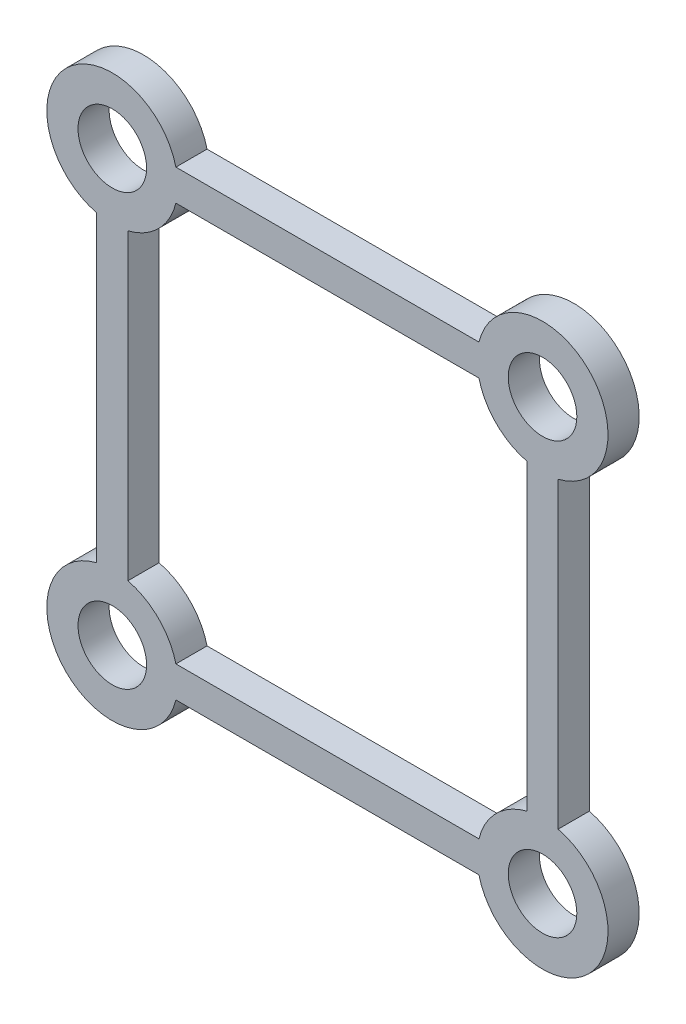
ISO-10303-21;
HEADER;
FILE_DESCRIPTION(('STEP AP214'),'2;1');
FILE_NAME('part.step','',(''),(''),'','','');
FILE_SCHEMA(('AUTOMOTIVE_DESIGN { 1 0 10303 214 1 1 1 1 }'));
ENDSEC;
DATA;
#1=APPLICATION_CONTEXT('core data for automotive mechanical design processes');
#2=APPLICATION_PROTOCOL_DEFINITION('international standard','automotive_design',2000,#1);
#3=PRODUCT_CONTEXT('',#1,'mechanical');
#4=PRODUCT('Part','Part','',(#3));
#5=PRODUCT_RELATED_PRODUCT_CATEGORY('part','',(#4));
#6=PRODUCT_DEFINITION_FORMATION('','',#4);
#7=PRODUCT_DEFINITION_CONTEXT('part definition',#1,'design');
#8=PRODUCT_DEFINITION('design','',#6,#7);
#9=PRODUCT_DEFINITION_SHAPE('','',#8);
#10=(LENGTH_UNIT() NAMED_UNIT(*) SI_UNIT(.MILLI.,.METRE.));
#11=(NAMED_UNIT(*) PLANE_ANGLE_UNIT() SI_UNIT($,.RADIAN.));
#12=(NAMED_UNIT(*) SI_UNIT($,.STERADIAN.) SOLID_ANGLE_UNIT());
#13=UNCERTAINTY_MEASURE_WITH_UNIT(LENGTH_MEASURE(1.E-05),#10,'distance_accuracy_value','');
#14=(GEOMETRIC_REPRESENTATION_CONTEXT(3) GLOBAL_UNCERTAINTY_ASSIGNED_CONTEXT((#13)) GLOBAL_UNIT_ASSIGNED_CONTEXT((#10,
#11,#12)) REPRESENTATION_CONTEXT('',''));
#15=CARTESIAN_POINT('',(0.,0.,0.));
#16=DIRECTION('',(0.,0.,1.));
#17=DIRECTION('',(1.,0.,0.));
#18=AXIS2_PLACEMENT_3D('',#15,#16,#17);
#19=CARTESIAN_POINT('',(6.9,6.9,1.));
#20=DIRECTION('',(0.,0.,1.));
#21=DIRECTION('',(1.,0.,0.));
#22=AXIS2_PLACEMENT_3D('',#19,#20,#21);
#23=PLANE('',#22);
#24=CARTESIAN_POINT('',(6.9,-6.9,1.));
#25=DIRECTION('',(0.,0.,1.));
#26=DIRECTION('',(1.,0.,0.));
#27=AXIS2_PLACEMENT_3D('',#24,#25,#26);
#28=CIRCLE('',#27,1.1);
#29=CARTESIAN_POINT('',(8.,-6.9,1.));
#30=VERTEX_POINT('',#29);
#31=EDGE_CURVE('E257',#30,#30,#28,.T.);
#32=ORIENTED_EDGE('',*,*,#31,.F.);
#33=EDGE_LOOP('',(#32));
#34=FACE_BOUND('',#33,.T.);
#35=CARTESIAN_POINT('',(-6.9,-6.9,1.));
#36=DIRECTION('',(0.,0.,1.));
#37=DIRECTION('',(1.,0.,0.));
#38=AXIS2_PLACEMENT_3D('',#35,#36,#37);
#39=CIRCLE('',#38,1.1);
#40=CARTESIAN_POINT('',(-5.8,-6.9,1.));
#41=VERTEX_POINT('',#40);
#42=EDGE_CURVE('E275',#41,#41,#39,.T.);
#43=ORIENTED_EDGE('',*,*,#42,.F.);
#44=EDGE_LOOP('',(#43));
#45=FACE_BOUND('',#44,.T.);
#46=CARTESIAN_POINT('',(6.9,6.9,1.));
#47=DIRECTION('',(0.,0.,1.));
#48=DIRECTION('',(1.,0.,0.));
#49=AXIS2_PLACEMENT_3D('',#46,#47,#48);
#50=CIRCLE('',#49,2.1);
#51=CARTESIAN_POINT('',(7.4,4.86039219456289,1.));
#52=VERTEX_POINT('',#51);
#53=CARTESIAN_POINT('',(4.86039219456289,7.4,1.));
#54=VERTEX_POINT('',#53);
#55=EDGE_CURVE('E278',#52,#54,#50,.T.);
#56=ORIENTED_EDGE('',*,*,#55,.T.);
#57=DIRECTION('',(-1.,0.,0.));
#58=VECTOR('',#57,1.);
#59=CARTESIAN_POINT('',(4.86039219456289,7.4,1.));
#60=LINE('',#59,#58);
#61=CARTESIAN_POINT('',(-4.86039219456289,7.4,1.));
#62=VERTEX_POINT('',#61);
#63=EDGE_CURVE('E281',#54,#62,#60,.T.);
#64=ORIENTED_EDGE('',*,*,#63,.T.);
#65=CARTESIAN_POINT('',(-6.9,6.9,1.));
#66=DIRECTION('',(0.,0.,1.));
#67=DIRECTION('',(1.,0.,0.));
#68=AXIS2_PLACEMENT_3D('',#65,#66,#67);
#69=CIRCLE('',#68,2.1);
#70=CARTESIAN_POINT('',(-7.4,4.86039219456289,1.));
#71=VERTEX_POINT('',#70);
#72=EDGE_CURVE('E290',#62,#71,#69,.T.);
#73=ORIENTED_EDGE('',*,*,#72,.T.);
#74=DIRECTION('',(0.,-1.,0.));
#75=VECTOR('',#74,1.);
#76=CARTESIAN_POINT('',(-7.4,-4.86039219456289,1.));
#77=LINE('',#76,#75);
#78=CARTESIAN_POINT('',(-7.4,-4.86039219456289,1.));
#79=VERTEX_POINT('',#78);
#80=EDGE_CURVE('E293',#71,#79,#77,.T.);
#81=ORIENTED_EDGE('',*,*,#80,.T.);
#82=CARTESIAN_POINT('',(-6.9,-6.9,1.));
#83=DIRECTION('',(0.,0.,1.));
#84=DIRECTION('',(1.,0.,0.));
#85=AXIS2_PLACEMENT_3D('',#82,#83,#84);
#86=CIRCLE('',#85,2.1);
#87=CARTESIAN_POINT('',(-4.86039219456289,-7.4,1.));
#88=VERTEX_POINT('',#87);
#89=EDGE_CURVE('E295',#79,#88,#86,.T.);
#90=ORIENTED_EDGE('',*,*,#89,.T.);
#91=DIRECTION('',(1.,0.,0.));
#92=VECTOR('',#91,1.);
#93=CARTESIAN_POINT('',(4.86039219456289,-7.4,1.));
#94=LINE('',#93,#92);
#95=CARTESIAN_POINT('',(4.86039219456289,-7.4,1.));
#96=VERTEX_POINT('',#95);
#97=EDGE_CURVE('E300',#88,#96,#94,.T.);
#98=ORIENTED_EDGE('',*,*,#97,.T.);
#99=CARTESIAN_POINT('',(6.9,-6.9,1.));
#100=DIRECTION('',(0.,0.,1.));
#101=DIRECTION('',(1.,0.,0.));
#102=AXIS2_PLACEMENT_3D('',#99,#100,#101);
#103=CIRCLE('',#102,2.1);
#104=CARTESIAN_POINT('',(7.4,-4.86039219456289,1.));
#105=VERTEX_POINT('',#104);
#106=EDGE_CURVE('E297',#96,#105,#103,.T.);
#107=ORIENTED_EDGE('',*,*,#106,.T.);
#108=DIRECTION('',(0.,1.,0.));
#109=VECTOR('',#108,1.);
#110=CARTESIAN_POINT('',(7.4,-4.86039219456289,1.));
#111=LINE('',#110,#109);
#112=EDGE_CURVE('E303',#105,#52,#111,.T.);
#113=ORIENTED_EDGE('',*,*,#112,.T.);
#114=EDGE_LOOP('',(#56,#64,#73,#81,#90,#98,#107,#113));
#115=FACE_BOUND('',#114,.T.);
#116=CARTESIAN_POINT('',(-6.9,6.9,1.));
#117=DIRECTION('',(0.,0.,1.));
#118=DIRECTION('',(1.,0.,0.));
#119=AXIS2_PLACEMENT_3D('',#116,#117,#118);
#120=CIRCLE('',#119,1.1);
#121=CARTESIAN_POINT('',(-5.8,6.9,1.));
#122=VERTEX_POINT('',#121);
#123=EDGE_CURVE('E261',#122,#122,#120,.T.);
#124=ORIENTED_EDGE('',*,*,#123,.F.);
#125=EDGE_LOOP('',(#124));
#126=FACE_BOUND('',#125,.T.);
#127=CARTESIAN_POINT('',(6.9,6.9,1.));
#128=DIRECTION('',(0.,0.,1.));
#129=DIRECTION('',(1.,0.,0.));
#130=AXIS2_PLACEMENT_3D('',#127,#128,#129);
#131=CIRCLE('',#130,1.1);
#132=CARTESIAN_POINT('',(8.,6.9,1.));
#133=VERTEX_POINT('',#132);
#134=EDGE_CURVE('E247',#133,#133,#131,.T.);
#135=ORIENTED_EDGE('',*,*,#134,.F.);
#136=EDGE_LOOP('',(#135));
#137=FACE_BOUND('',#136,.T.);
#138=DIRECTION('',(0.,-1.,0.));
#139=VECTOR('',#138,1.);
#140=CARTESIAN_POINT('',(-6.4,-4.86039219456289,1.));
#141=LINE('',#140,#139);
#142=CARTESIAN_POINT('',(-6.4,4.86039219456289,1.));
#143=VERTEX_POINT('',#142);
#144=CARTESIAN_POINT('',(-6.4,-4.86039219456289,1.));
#145=VERTEX_POINT('',#144);
#146=EDGE_CURVE('E166',#143,#145,#141,.T.);
#147=ORIENTED_EDGE('',*,*,#146,.F.);
#148=CARTESIAN_POINT('',(-6.9,6.9,1.));
#149=DIRECTION('',(0.,0.,-1.));
#150=DIRECTION('',(1.,0.,0.));
#151=AXIS2_PLACEMENT_3D('',#148,#149,#150);
#152=CIRCLE('',#151,2.1);
#153=CARTESIAN_POINT('',(-4.86039219456289,6.4,1.));
#154=VERTEX_POINT('',#153);
#155=EDGE_CURVE('E156',#154,#143,#152,.T.);
#156=ORIENTED_EDGE('',*,*,#155,.F.);
#157=DIRECTION('',(-1.,0.,0.));
#158=VECTOR('',#157,1.);
#159=CARTESIAN_POINT('',(4.86039219456289,6.4,1.));
#160=LINE('',#159,#158);
#161=CARTESIAN_POINT('',(4.86039219456289,6.4,1.));
#162=VERTEX_POINT('',#161);
#163=EDGE_CURVE('E198',#162,#154,#160,.T.);
#164=ORIENTED_EDGE('',*,*,#163,.F.);
#165=CARTESIAN_POINT('',(6.9,6.9,1.));
#166=DIRECTION('',(0.,0.,-1.));
#167=DIRECTION('',(1.,0.,0.));
#168=AXIS2_PLACEMENT_3D('',#165,#166,#167);
#169=CIRCLE('',#168,2.1);
#170=CARTESIAN_POINT('',(6.4,4.86039219456289,1.));
#171=VERTEX_POINT('',#170);
#172=EDGE_CURVE('E199',#171,#162,#169,.T.);
#173=ORIENTED_EDGE('',*,*,#172,.F.);
#174=DIRECTION('',(0.,1.,0.));
#175=VECTOR('',#174,1.);
#176=CARTESIAN_POINT('',(6.4,-4.86039219456289,1.));
#177=LINE('',#176,#175);
#178=CARTESIAN_POINT('',(6.4,-4.86039219456289,1.));
#179=VERTEX_POINT('',#178);
#180=EDGE_CURVE('E191',#179,#171,#177,.T.);
#181=ORIENTED_EDGE('',*,*,#180,.F.);
#182=CARTESIAN_POINT('',(6.9,-6.9,1.));
#183=DIRECTION('',(0.,0.,-1.));
#184=DIRECTION('',(1.,0.,0.));
#185=AXIS2_PLACEMENT_3D('',#182,#183,#184);
#186=CIRCLE('',#185,2.1);
#187=CARTESIAN_POINT('',(4.86039219456289,-6.4,1.));
#188=VERTEX_POINT('',#187);
#189=EDGE_CURVE('E192',#188,#179,#186,.T.);
#190=ORIENTED_EDGE('',*,*,#189,.F.);
#191=DIRECTION('',(1.,0.,0.));
#192=VECTOR('',#191,1.);
#193=CARTESIAN_POINT('',(4.86039219456289,-6.4,1.));
#194=LINE('',#193,#192);
#195=CARTESIAN_POINT('',(-4.86039219456289,-6.4,1.));
#196=VERTEX_POINT('',#195);
#197=EDGE_CURVE('E187',#196,#188,#194,.T.);
#198=ORIENTED_EDGE('',*,*,#197,.F.);
#199=CARTESIAN_POINT('',(-6.9,-6.9,1.));
#200=DIRECTION('',(0.,0.,-1.));
#201=DIRECTION('',(1.,0.,0.));
#202=AXIS2_PLACEMENT_3D('',#199,#200,#201);
#203=CIRCLE('',#202,2.1);
#204=EDGE_CURVE('E185',#145,#196,#203,.T.);
#205=ORIENTED_EDGE('',*,*,#204,.F.);
#206=EDGE_LOOP('',(#147,#156,#164,#173,#181,#190,#198,#205));
#207=FACE_BOUND('',#206,.T.);
#208=ADVANCED_FACE('F44',(#34,#45,#115,#126,#137,#207),#23,.T.);
#209=CARTESIAN_POINT('',(6.9,6.9,0.));
#210=DIRECTION('',(0.,0.,1.));
#211=DIRECTION('',(1.,0.,0.));
#212=AXIS2_PLACEMENT_3D('',#209,#210,#211);
#213=PLANE('',#212);
#214=CARTESIAN_POINT('',(6.9,6.9,0.));
#215=DIRECTION('',(0.,0.,1.));
#216=DIRECTION('',(1.,0.,0.));
#217=AXIS2_PLACEMENT_3D('',#214,#215,#216);
#218=CIRCLE('',#217,1.1);
#219=CARTESIAN_POINT('',(8.,6.9,0.));
#220=VERTEX_POINT('',#219);
#221=EDGE_CURVE('E180',#220,#220,#218,.T.);
#222=ORIENTED_EDGE('',*,*,#221,.T.);
#223=EDGE_LOOP('',(#222));
#224=FACE_BOUND('',#223,.T.);
#225=CARTESIAN_POINT('',(6.9,-6.9,0.));
#226=DIRECTION('',(0.,0.,1.));
#227=DIRECTION('',(1.,0.,0.));
#228=AXIS2_PLACEMENT_3D('',#225,#226,#227);
#229=CIRCLE('',#228,1.1);
#230=CARTESIAN_POINT('',(8.,-6.9,0.));
#231=VERTEX_POINT('',#230);
#232=EDGE_CURVE('E255',#231,#231,#229,.T.);
#233=ORIENTED_EDGE('',*,*,#232,.T.);
#234=EDGE_LOOP('',(#233));
#235=FACE_BOUND('',#234,.T.);
#236=CARTESIAN_POINT('',(-6.9,6.9,0.));
#237=DIRECTION('',(0.,0.,1.));
#238=DIRECTION('',(1.,0.,0.));
#239=AXIS2_PLACEMENT_3D('',#236,#237,#238);
#240=CIRCLE('',#239,1.1);
#241=CARTESIAN_POINT('',(-5.8,6.9,0.));
#242=VERTEX_POINT('',#241);
#243=EDGE_CURVE('E258',#242,#242,#240,.T.);
#244=ORIENTED_EDGE('',*,*,#243,.T.);
#245=EDGE_LOOP('',(#244));
#246=FACE_BOUND('',#245,.T.);
#247=CARTESIAN_POINT('',(-6.9,-6.9,0.));
#248=DIRECTION('',(0.,0.,1.));
#249=DIRECTION('',(1.,0.,0.));
#250=AXIS2_PLACEMENT_3D('',#247,#248,#249);
#251=CIRCLE('',#250,1.1);
#252=CARTESIAN_POINT('',(-5.8,-6.9,0.));
#253=VERTEX_POINT('',#252);
#254=EDGE_CURVE('E270',#253,#253,#251,.T.);
#255=ORIENTED_EDGE('',*,*,#254,.T.);
#256=EDGE_LOOP('',(#255));
#257=FACE_BOUND('',#256,.T.);
#258=CARTESIAN_POINT('',(6.9,6.9,0.));
#259=DIRECTION('',(0.,0.,1.));
#260=DIRECTION('',(1.,0.,0.));
#261=AXIS2_PLACEMENT_3D('',#258,#259,#260);
#262=CIRCLE('',#261,2.1);
#263=CARTESIAN_POINT('',(7.4,4.86039219456289,0.));
#264=VERTEX_POINT('',#263);
#265=CARTESIAN_POINT('',(4.86039219456289,7.4,0.));
#266=VERTEX_POINT('',#265);
#267=EDGE_CURVE('E277',#264,#266,#262,.T.);
#268=ORIENTED_EDGE('',*,*,#267,.F.);
#269=DIRECTION('',(0.,1.,0.));
#270=VECTOR('',#269,1.);
#271=CARTESIAN_POINT('',(7.4,-4.86039219456289,0.));
#272=LINE('',#271,#270);
#273=CARTESIAN_POINT('',(7.4,-4.86039219456289,0.));
#274=VERTEX_POINT('',#273);
#275=EDGE_CURVE('E283',#274,#264,#272,.T.);
#276=ORIENTED_EDGE('',*,*,#275,.F.);
#277=CARTESIAN_POINT('',(6.9,-6.9,0.));
#278=DIRECTION('',(0.,0.,1.));
#279=DIRECTION('',(1.,0.,0.));
#280=AXIS2_PLACEMENT_3D('',#277,#278,#279);
#281=CIRCLE('',#280,2.1);
#282=CARTESIAN_POINT('',(4.86039219456289,-7.4,0.));
#283=VERTEX_POINT('',#282);
#284=EDGE_CURVE('E323',#283,#274,#281,.T.);
#285=ORIENTED_EDGE('',*,*,#284,.F.);
#286=DIRECTION('',(1.,0.,0.));
#287=VECTOR('',#286,1.);
#288=CARTESIAN_POINT('',(4.86039219456289,-7.4,0.));
#289=LINE('',#288,#287);
#290=CARTESIAN_POINT('',(-4.86039219456289,-7.4,0.));
#291=VERTEX_POINT('',#290);
#292=EDGE_CURVE('E325',#291,#283,#289,.T.);
#293=ORIENTED_EDGE('',*,*,#292,.F.);
#294=CARTESIAN_POINT('',(-6.9,-6.9,0.));
#295=DIRECTION('',(0.,0.,1.));
#296=DIRECTION('',(1.,0.,0.));
#297=AXIS2_PLACEMENT_3D('',#294,#295,#296);
#298=CIRCLE('',#297,2.1);
#299=CARTESIAN_POINT('',(-7.4,-4.86039219456289,0.));
#300=VERTEX_POINT('',#299);
#301=EDGE_CURVE('E316',#300,#291,#298,.T.);
#302=ORIENTED_EDGE('',*,*,#301,.F.);
#303=DIRECTION('',(0.,-1.,0.));
#304=VECTOR('',#303,1.);
#305=CARTESIAN_POINT('',(-7.4,-4.86039219456289,0.));
#306=LINE('',#305,#304);
#307=CARTESIAN_POINT('',(-7.4,4.86039219456289,0.));
#308=VERTEX_POINT('',#307);
#309=EDGE_CURVE('E317',#308,#300,#306,.T.);
#310=ORIENTED_EDGE('',*,*,#309,.F.);
#311=CARTESIAN_POINT('',(-6.9,6.9,0.));
#312=DIRECTION('',(0.,0.,1.));
#313=DIRECTION('',(1.,0.,0.));
#314=AXIS2_PLACEMENT_3D('',#311,#312,#313);
#315=CIRCLE('',#314,2.1);
#316=CARTESIAN_POINT('',(-4.86039219456289,7.4,0.));
#317=VERTEX_POINT('',#316);
#318=EDGE_CURVE('E312',#317,#308,#315,.T.);
#319=ORIENTED_EDGE('',*,*,#318,.F.);
#320=DIRECTION('',(-1.,0.,0.));
#321=VECTOR('',#320,1.);
#322=CARTESIAN_POINT('',(4.86039219456289,7.4,0.));
#323=LINE('',#322,#321);
#324=EDGE_CURVE('E309',#266,#317,#323,.T.);
#325=ORIENTED_EDGE('',*,*,#324,.F.);
#326=EDGE_LOOP('',(#268,#276,#285,#293,#302,#310,#319,#325));
#327=FACE_BOUND('',#326,.T.);
#328=CARTESIAN_POINT('',(-6.9,6.9,0.));
#329=DIRECTION('',(0.,0.,-1.));
#330=DIRECTION('',(1.,0.,0.));
#331=AXIS2_PLACEMENT_3D('',#328,#329,#330);
#332=CIRCLE('',#331,2.1);
#333=CARTESIAN_POINT('',(-4.86039219456289,6.4,0.));
#334=VERTEX_POINT('',#333);
#335=CARTESIAN_POINT('',(-6.4,4.86039219456289,0.));
#336=VERTEX_POINT('',#335);
#337=EDGE_CURVE('E66',#334,#336,#332,.T.);
#338=ORIENTED_EDGE('',*,*,#337,.T.);
#339=DIRECTION('',(0.,-1.,0.));
#340=VECTOR('',#339,1.);
#341=CARTESIAN_POINT('',(-6.4,-4.86039219456289,0.));
#342=LINE('',#341,#340);
#343=CARTESIAN_POINT('',(-6.4,-4.86039219456289,0.));
#344=VERTEX_POINT('',#343);
#345=EDGE_CURVE('E174',#336,#344,#342,.T.);
#346=ORIENTED_EDGE('',*,*,#345,.T.);
#347=CARTESIAN_POINT('',(-6.9,-6.9,0.));
#348=DIRECTION('',(0.,0.,-1.));
#349=DIRECTION('',(1.,0.,0.));
#350=AXIS2_PLACEMENT_3D('',#347,#348,#349);
#351=CIRCLE('',#350,2.1);
#352=CARTESIAN_POINT('',(-4.86039219456289,-6.4,0.));
#353=VERTEX_POINT('',#352);
#354=EDGE_CURVE('E210',#344,#353,#351,.T.);
#355=ORIENTED_EDGE('',*,*,#354,.T.);
#356=DIRECTION('',(1.,0.,0.));
#357=VECTOR('',#356,1.);
#358=CARTESIAN_POINT('',(4.86039219456289,-6.4,0.));
#359=LINE('',#358,#357);
#360=CARTESIAN_POINT('',(4.86039219456289,-6.4,0.));
#361=VERTEX_POINT('',#360);
#362=EDGE_CURVE('E212',#353,#361,#359,.T.);
#363=ORIENTED_EDGE('',*,*,#362,.T.);
#364=CARTESIAN_POINT('',(6.9,-6.9,0.));
#365=DIRECTION('',(0.,0.,-1.));
#366=DIRECTION('',(1.,0.,0.));
#367=AXIS2_PLACEMENT_3D('',#364,#365,#366);
#368=CIRCLE('',#367,2.1);
#369=CARTESIAN_POINT('',(6.4,-4.86039219456289,0.));
#370=VERTEX_POINT('',#369);
#371=EDGE_CURVE('E213',#361,#370,#368,.T.);
#372=ORIENTED_EDGE('',*,*,#371,.T.);
#373=DIRECTION('',(0.,1.,0.));
#374=VECTOR('',#373,1.);
#375=CARTESIAN_POINT('',(6.4,-4.86039219456289,0.));
#376=LINE('',#375,#374);
#377=CARTESIAN_POINT('',(6.4,4.86039219456289,0.));
#378=VERTEX_POINT('',#377);
#379=EDGE_CURVE('E216',#370,#378,#376,.T.);
#380=ORIENTED_EDGE('',*,*,#379,.T.);
#381=CARTESIAN_POINT('',(6.9,6.9,0.));
#382=DIRECTION('',(0.,0.,-1.));
#383=DIRECTION('',(1.,0.,0.));
#384=AXIS2_PLACEMENT_3D('',#381,#382,#383);
#385=CIRCLE('',#384,2.1);
#386=CARTESIAN_POINT('',(4.86039219456289,6.4,0.));
#387=VERTEX_POINT('',#386);
#388=EDGE_CURVE('E225',#378,#387,#385,.T.);
#389=ORIENTED_EDGE('',*,*,#388,.T.);
#390=DIRECTION('',(-1.,0.,0.));
#391=VECTOR('',#390,1.);
#392=CARTESIAN_POINT('',(4.86039219456289,6.4,0.));
#393=LINE('',#392,#391);
#394=EDGE_CURVE('E169',#387,#334,#393,.T.);
#395=ORIENTED_EDGE('',*,*,#394,.T.);
#396=EDGE_LOOP('',(#338,#346,#355,#363,#372,#380,#389,#395));
#397=FACE_BOUND('',#396,.T.);
#398=ADVANCED_FACE('F364',(#224,#235,#246,#257,#327,#397),#213,.F.);
#399=CARTESIAN_POINT('',(6.9,6.9,1.));
#400=DIRECTION('',(0.,0.,-1.));
#401=DIRECTION('',(-1.,0.,0.));
#402=AXIS2_PLACEMENT_3D('',#399,#400,#401);
#403=CYLINDRICAL_SURFACE('',#402,2.1);
#404=ORIENTED_EDGE('',*,*,#267,.T.);
#405=DIRECTION('',(0.,0.,-1.));
#406=VECTOR('',#405,1.);
#407=CARTESIAN_POINT('',(4.86039219456289,7.4,1.));
#408=LINE('',#407,#406);
#409=EDGE_CURVE('E11',#54,#266,#408,.T.);
#410=ORIENTED_EDGE('',*,*,#409,.F.);
#411=ORIENTED_EDGE('',*,*,#55,.F.);
#412=DIRECTION('',(0.,0.,-1.));
#413=VECTOR('',#412,1.);
#414=CARTESIAN_POINT('',(7.4,4.86039219456289,1.));
#415=LINE('',#414,#413);
#416=EDGE_CURVE('E306',#52,#264,#415,.T.);
#417=ORIENTED_EDGE('',*,*,#416,.T.);
#418=EDGE_LOOP('',(#404,#410,#411,#417));
#419=FACE_BOUND('',#418,.T.);
#420=ADVANCED_FACE('F50',(#419),#403,.T.);
#421=CARTESIAN_POINT('',(4.86039219456289,7.4,1.));
#422=DIRECTION('',(0.,-1.,0.));
#423=DIRECTION('',(0.,0.,-1.));
#424=AXIS2_PLACEMENT_3D('',#421,#422,#423);
#425=PLANE('',#424);
#426=ORIENTED_EDGE('',*,*,#324,.T.);
#427=DIRECTION('',(0.,0.,-1.));
#428=VECTOR('',#427,1.);
#429=CARTESIAN_POINT('',(-4.86039219456289,7.4,1.));
#430=LINE('',#429,#428);
#431=EDGE_CURVE('E53',#62,#317,#430,.T.);
#432=ORIENTED_EDGE('',*,*,#431,.F.);
#433=ORIENTED_EDGE('',*,*,#63,.F.);
#434=ORIENTED_EDGE('',*,*,#409,.T.);
#435=EDGE_LOOP('',(#426,#432,#433,#434));
#436=FACE_BOUND('',#435,.T.);
#437=ADVANCED_FACE('F385',(#436),#425,.F.);
#438=CARTESIAN_POINT('',(-6.9,6.9,1.));
#439=DIRECTION('',(0.,0.,-1.));
#440=DIRECTION('',(-1.,0.,0.));
#441=AXIS2_PLACEMENT_3D('',#438,#439,#440);
#442=CYLINDRICAL_SURFACE('',#441,2.1);
#443=ORIENTED_EDGE('',*,*,#318,.T.);
#444=DIRECTION('',(0.,0.,-1.));
#445=VECTOR('',#444,1.);
#446=CARTESIAN_POINT('',(-7.4,4.86039219456289,1.));
#447=LINE('',#446,#445);
#448=EDGE_CURVE('E346',#71,#308,#447,.T.);
#449=ORIENTED_EDGE('',*,*,#448,.F.);
#450=ORIENTED_EDGE('',*,*,#72,.F.);
#451=ORIENTED_EDGE('',*,*,#431,.T.);
#452=EDGE_LOOP('',(#443,#449,#450,#451));
#453=FACE_BOUND('',#452,.T.);
#454=ADVANCED_FACE('F356',(#453),#442,.T.);
#455=CARTESIAN_POINT('',(-7.4,-4.86039219456289,1.));
#456=DIRECTION('',(1.,0.,0.));
#457=DIRECTION('',(0.,1.,0.));
#458=AXIS2_PLACEMENT_3D('',#455,#456,#457);
#459=PLANE('',#458);
#460=ORIENTED_EDGE('',*,*,#309,.T.);
#461=DIRECTION('',(0.,0.,-1.));
#462=VECTOR('',#461,1.);
#463=CARTESIAN_POINT('',(-7.4,-4.86039219456289,1.));
#464=LINE('',#463,#462);
#465=EDGE_CURVE('E343',#79,#300,#464,.T.);
#466=ORIENTED_EDGE('',*,*,#465,.F.);
#467=ORIENTED_EDGE('',*,*,#80,.F.);
#468=ORIENTED_EDGE('',*,*,#448,.T.);
#469=EDGE_LOOP('',(#460,#466,#467,#468));
#470=FACE_BOUND('',#469,.T.);
#471=ADVANCED_FACE('F369',(#470),#459,.F.);
#472=CARTESIAN_POINT('',(-6.9,-6.9,1.));
#473=DIRECTION('',(0.,0.,-1.));
#474=DIRECTION('',(-1.,0.,0.));
#475=AXIS2_PLACEMENT_3D('',#472,#473,#474);
#476=CYLINDRICAL_SURFACE('',#475,2.1);
#477=ORIENTED_EDGE('',*,*,#301,.T.);
#478=DIRECTION('',(0.,0.,-1.));
#479=VECTOR('',#478,1.);
#480=CARTESIAN_POINT('',(-4.86039219456289,-7.4,1.));
#481=LINE('',#480,#479);
#482=EDGE_CURVE('E342',#88,#291,#481,.T.);
#483=ORIENTED_EDGE('',*,*,#482,.F.);
#484=ORIENTED_EDGE('',*,*,#89,.F.);
#485=ORIENTED_EDGE('',*,*,#465,.T.);
#486=EDGE_LOOP('',(#477,#483,#484,#485));
#487=FACE_BOUND('',#486,.T.);
#488=ADVANCED_FACE('F372',(#487),#476,.T.);
#489=CARTESIAN_POINT('',(4.86039219456289,-7.4,1.));
#490=DIRECTION('',(0.,1.,0.));
#491=DIRECTION('',(0.,0.,1.));
#492=AXIS2_PLACEMENT_3D('',#489,#490,#491);
#493=PLANE('',#492);
#494=ORIENTED_EDGE('',*,*,#292,.T.);
#495=DIRECTION('',(0.,0.,-1.));
#496=VECTOR('',#495,1.);
#497=CARTESIAN_POINT('',(4.86039219456289,-7.4,1.));
#498=LINE('',#497,#496);
#499=EDGE_CURVE('E340',#96,#283,#498,.T.);
#500=ORIENTED_EDGE('',*,*,#499,.F.);
#501=ORIENTED_EDGE('',*,*,#97,.F.);
#502=ORIENTED_EDGE('',*,*,#482,.T.);
#503=EDGE_LOOP('',(#494,#500,#501,#502));
#504=FACE_BOUND('',#503,.T.);
#505=ADVANCED_FACE('F393',(#504),#493,.F.);
#506=CARTESIAN_POINT('',(6.9,-6.9,1.));
#507=DIRECTION('',(0.,0.,-1.));
#508=DIRECTION('',(-1.,0.,0.));
#509=AXIS2_PLACEMENT_3D('',#506,#507,#508);
#510=CYLINDRICAL_SURFACE('',#509,2.1);
#511=ORIENTED_EDGE('',*,*,#284,.T.);
#512=DIRECTION('',(0.,0.,-1.));
#513=VECTOR('',#512,1.);
#514=CARTESIAN_POINT('',(7.4,-4.86039219456289,1.));
#515=LINE('',#514,#513);
#516=EDGE_CURVE('E335',#105,#274,#515,.T.);
#517=ORIENTED_EDGE('',*,*,#516,.F.);
#518=ORIENTED_EDGE('',*,*,#106,.F.);
#519=ORIENTED_EDGE('',*,*,#499,.T.);
#520=EDGE_LOOP('',(#511,#517,#518,#519));
#521=FACE_BOUND('',#520,.T.);
#522=ADVANCED_FACE('F395',(#521),#510,.T.);
#523=CARTESIAN_POINT('',(7.4,-4.86039219456289,1.));
#524=DIRECTION('',(-1.,0.,0.));
#525=DIRECTION('',(0.,0.,1.));
#526=AXIS2_PLACEMENT_3D('',#523,#524,#525);
#527=PLANE('',#526);
#528=ORIENTED_EDGE('',*,*,#275,.T.);
#529=ORIENTED_EDGE('',*,*,#416,.F.);
#530=ORIENTED_EDGE('',*,*,#112,.F.);
#531=ORIENTED_EDGE('',*,*,#516,.T.);
#532=EDGE_LOOP('',(#528,#529,#530,#531));
#533=FACE_BOUND('',#532,.T.);
#534=ADVANCED_FACE('F389',(#533),#527,.F.);
#535=CARTESIAN_POINT('',(-6.9,-6.9,1.));
#536=DIRECTION('',(0.,0.,-1.));
#537=DIRECTION('',(-1.,0.,0.));
#538=AXIS2_PLACEMENT_3D('',#535,#536,#537);
#539=CYLINDRICAL_SURFACE('',#538,1.1);
#540=ORIENTED_EDGE('',*,*,#42,.T.);
#541=EDGE_LOOP('',(#540));
#542=FACE_BOUND('',#541,.T.);
#543=ORIENTED_EDGE('',*,*,#254,.F.);
#544=EDGE_LOOP('',(#543));
#545=FACE_BOUND('',#544,.T.);
#546=ADVANCED_FACE('F413',(#542,#545),#539,.F.);
#547=CARTESIAN_POINT('',(-6.9,6.9,1.));
#548=DIRECTION('',(0.,0.,-1.));
#549=DIRECTION('',(-1.,0.,0.));
#550=AXIS2_PLACEMENT_3D('',#547,#548,#549);
#551=CYLINDRICAL_SURFACE('',#550,1.1);
#552=ORIENTED_EDGE('',*,*,#123,.T.);
#553=EDGE_LOOP('',(#552));
#554=FACE_BOUND('',#553,.T.);
#555=ORIENTED_EDGE('',*,*,#243,.F.);
#556=EDGE_LOOP('',(#555));
#557=FACE_BOUND('',#556,.T.);
#558=ADVANCED_FACE('F422',(#554,#557),#551,.F.);
#559=CARTESIAN_POINT('',(6.9,-6.9,1.));
#560=DIRECTION('',(0.,0.,-1.));
#561=DIRECTION('',(-1.,0.,0.));
#562=AXIS2_PLACEMENT_3D('',#559,#560,#561);
#563=CYLINDRICAL_SURFACE('',#562,1.1);
#564=ORIENTED_EDGE('',*,*,#31,.T.);
#565=EDGE_LOOP('',(#564));
#566=FACE_BOUND('',#565,.T.);
#567=ORIENTED_EDGE('',*,*,#232,.F.);
#568=EDGE_LOOP('',(#567));
#569=FACE_BOUND('',#568,.T.);
#570=ADVANCED_FACE('F430',(#566,#569),#563,.F.);
#571=CARTESIAN_POINT('',(6.9,6.9,1.));
#572=DIRECTION('',(0.,0.,-1.));
#573=DIRECTION('',(-1.,0.,0.));
#574=AXIS2_PLACEMENT_3D('',#571,#572,#573);
#575=CYLINDRICAL_SURFACE('',#574,1.1);
#576=ORIENTED_EDGE('',*,*,#134,.T.);
#577=EDGE_LOOP('',(#576));
#578=FACE_BOUND('',#577,.T.);
#579=ORIENTED_EDGE('',*,*,#221,.F.);
#580=EDGE_LOOP('',(#579));
#581=FACE_BOUND('',#580,.T.);
#582=ADVANCED_FACE('F436',(#578,#581),#575,.F.);
#583=CARTESIAN_POINT('',(-6.9,6.9,1.));
#584=DIRECTION('',(0.,0.,-1.));
#585=DIRECTION('',(-1.,0.,0.));
#586=AXIS2_PLACEMENT_3D('',#583,#584,#585);
#587=CYLINDRICAL_SURFACE('',#586,2.1);
#588=ORIENTED_EDGE('',*,*,#337,.F.);
#589=DIRECTION('',(0.,0.,-1.));
#590=VECTOR('',#589,1.);
#591=CARTESIAN_POINT('',(-4.86039219456289,6.4,1.));
#592=LINE('',#591,#590);
#593=EDGE_CURVE('E161',#154,#334,#592,.T.);
#594=ORIENTED_EDGE('',*,*,#593,.F.);
#595=ORIENTED_EDGE('',*,*,#155,.T.);
#596=DIRECTION('',(0.,0.,-1.));
#597=VECTOR('',#596,1.);
#598=CARTESIAN_POINT('',(-6.4,4.86039219456289,1.));
#599=LINE('',#598,#597);
#600=EDGE_CURVE('E162',#143,#336,#599,.T.);
#601=ORIENTED_EDGE('',*,*,#600,.T.);
#602=EDGE_LOOP('',(#588,#594,#595,#601));
#603=FACE_BOUND('',#602,.T.);
#604=ADVANCED_FACE('F163',(#603),#587,.T.);
#605=CARTESIAN_POINT('',(-6.4,-4.86039219456289,1.));
#606=DIRECTION('',(1.,0.,0.));
#607=DIRECTION('',(0.,1.,0.));
#608=AXIS2_PLACEMENT_3D('',#605,#606,#607);
#609=PLANE('',#608);
#610=ORIENTED_EDGE('',*,*,#345,.F.);
#611=ORIENTED_EDGE('',*,*,#600,.F.);
#612=ORIENTED_EDGE('',*,*,#146,.T.);
#613=DIRECTION('',(0.,0.,-1.));
#614=VECTOR('',#613,1.);
#615=CARTESIAN_POINT('',(-6.4,-4.86039219456289,1.));
#616=LINE('',#615,#614);
#617=EDGE_CURVE('E178',#145,#344,#616,.T.);
#618=ORIENTED_EDGE('',*,*,#617,.T.);
#619=EDGE_LOOP('',(#610,#611,#612,#618));
#620=FACE_BOUND('',#619,.T.);
#621=ADVANCED_FACE('F175',(#620),#609,.T.);
#622=CARTESIAN_POINT('',(-6.9,-6.9,1.));
#623=DIRECTION('',(0.,0.,-1.));
#624=DIRECTION('',(-1.,0.,0.));
#625=AXIS2_PLACEMENT_3D('',#622,#623,#624);
#626=CYLINDRICAL_SURFACE('',#625,2.1);
#627=ORIENTED_EDGE('',*,*,#354,.F.);
#628=ORIENTED_EDGE('',*,*,#617,.F.);
#629=ORIENTED_EDGE('',*,*,#204,.T.);
#630=DIRECTION('',(0.,0.,-1.));
#631=VECTOR('',#630,1.);
#632=CARTESIAN_POINT('',(-4.86039219456289,-6.4,1.));
#633=LINE('',#632,#631);
#634=EDGE_CURVE('E243',#196,#353,#633,.T.);
#635=ORIENTED_EDGE('',*,*,#634,.T.);
#636=EDGE_LOOP('',(#627,#628,#629,#635));
#637=FACE_BOUND('',#636,.T.);
#638=ADVANCED_FACE('F449',(#637),#626,.T.);
#639=CARTESIAN_POINT('',(4.86039219456289,-6.4,1.));
#640=DIRECTION('',(0.,1.,0.));
#641=DIRECTION('',(0.,0.,1.));
#642=AXIS2_PLACEMENT_3D('',#639,#640,#641);
#643=PLANE('',#642);
#644=ORIENTED_EDGE('',*,*,#362,.F.);
#645=ORIENTED_EDGE('',*,*,#634,.F.);
#646=ORIENTED_EDGE('',*,*,#197,.T.);
#647=DIRECTION('',(0.,0.,-1.));
#648=VECTOR('',#647,1.);
#649=CARTESIAN_POINT('',(4.86039219456289,-6.4,1.));
#650=LINE('',#649,#648);
#651=EDGE_CURVE('E239',#188,#361,#650,.T.);
#652=ORIENTED_EDGE('',*,*,#651,.T.);
#653=EDGE_LOOP('',(#644,#645,#646,#652));
#654=FACE_BOUND('',#653,.T.);
#655=ADVANCED_FACE('F452',(#654),#643,.T.);
#656=CARTESIAN_POINT('',(6.9,-6.9,1.));
#657=DIRECTION('',(0.,0.,-1.));
#658=DIRECTION('',(-1.,0.,0.));
#659=AXIS2_PLACEMENT_3D('',#656,#657,#658);
#660=CYLINDRICAL_SURFACE('',#659,2.1);
#661=ORIENTED_EDGE('',*,*,#371,.F.);
#662=ORIENTED_EDGE('',*,*,#651,.F.);
#663=ORIENTED_EDGE('',*,*,#189,.T.);
#664=DIRECTION('',(0.,0.,-1.));
#665=VECTOR('',#664,1.);
#666=CARTESIAN_POINT('',(6.4,-4.86039219456289,1.));
#667=LINE('',#666,#665);
#668=EDGE_CURVE('E240',#179,#370,#667,.T.);
#669=ORIENTED_EDGE('',*,*,#668,.T.);
#670=EDGE_LOOP('',(#661,#662,#663,#669));
#671=FACE_BOUND('',#670,.T.);
#672=ADVANCED_FACE('F453',(#671),#660,.T.);
#673=CARTESIAN_POINT('',(6.4,-4.86039219456289,1.));
#674=DIRECTION('',(-1.,0.,0.));
#675=DIRECTION('',(0.,0.,1.));
#676=AXIS2_PLACEMENT_3D('',#673,#674,#675);
#677=PLANE('',#676);
#678=ORIENTED_EDGE('',*,*,#379,.F.);
#679=ORIENTED_EDGE('',*,*,#668,.F.);
#680=ORIENTED_EDGE('',*,*,#180,.T.);
#681=DIRECTION('',(0.,0.,-1.));
#682=VECTOR('',#681,1.);
#683=CARTESIAN_POINT('',(6.4,4.86039219456289,1.));
#684=LINE('',#683,#682);
#685=EDGE_CURVE('E234',#171,#378,#684,.T.);
#686=ORIENTED_EDGE('',*,*,#685,.T.);
#687=EDGE_LOOP('',(#678,#679,#680,#686));
#688=FACE_BOUND('',#687,.T.);
#689=ADVANCED_FACE('F456',(#688),#677,.T.);
#690=CARTESIAN_POINT('',(6.9,6.9,1.));
#691=DIRECTION('',(0.,0.,-1.));
#692=DIRECTION('',(-1.,0.,0.));
#693=AXIS2_PLACEMENT_3D('',#690,#691,#692);
#694=CYLINDRICAL_SURFACE('',#693,2.1);
#695=ORIENTED_EDGE('',*,*,#388,.F.);
#696=ORIENTED_EDGE('',*,*,#685,.F.);
#697=ORIENTED_EDGE('',*,*,#172,.T.);
#698=DIRECTION('',(0.,0.,-1.));
#699=VECTOR('',#698,1.);
#700=CARTESIAN_POINT('',(4.86039219456289,6.4,1.));
#701=LINE('',#700,#699);
#702=EDGE_CURVE('E62',#162,#387,#701,.T.);
#703=ORIENTED_EDGE('',*,*,#702,.T.);
#704=EDGE_LOOP('',(#695,#696,#697,#703));
#705=FACE_BOUND('',#704,.T.);
#706=ADVANCED_FACE('F465',(#705),#694,.T.);
#707=CARTESIAN_POINT('',(4.86039219456289,6.4,1.));
#708=DIRECTION('',(0.,-1.,0.));
#709=DIRECTION('',(0.,0.,-1.));
#710=AXIS2_PLACEMENT_3D('',#707,#708,#709);
#711=PLANE('',#710);
#712=ORIENTED_EDGE('',*,*,#394,.F.);
#713=ORIENTED_EDGE('',*,*,#702,.F.);
#714=ORIENTED_EDGE('',*,*,#163,.T.);
#715=ORIENTED_EDGE('',*,*,#593,.T.);
#716=EDGE_LOOP('',(#712,#713,#714,#715));
#717=FACE_BOUND('',#716,.T.);
#718=ADVANCED_FACE('F470',(#717),#711,.T.);
#719=CLOSED_SHELL('',(#208,#398,#420,#437,#454,#471,#488,#505,#522,#534,#546,#558,#570,#582,
#604,#621,#638,#655,#672,#689,#706,#718));
#720=MANIFOLD_SOLID_BREP('B2',#719);
#721=ADVANCED_BREP_SHAPE_REPRESENTATION('',(#18,#720),#14);
#722=SHAPE_DEFINITION_REPRESENTATION(#9,#721);
ENDSEC;
END-ISO-10303-21;
